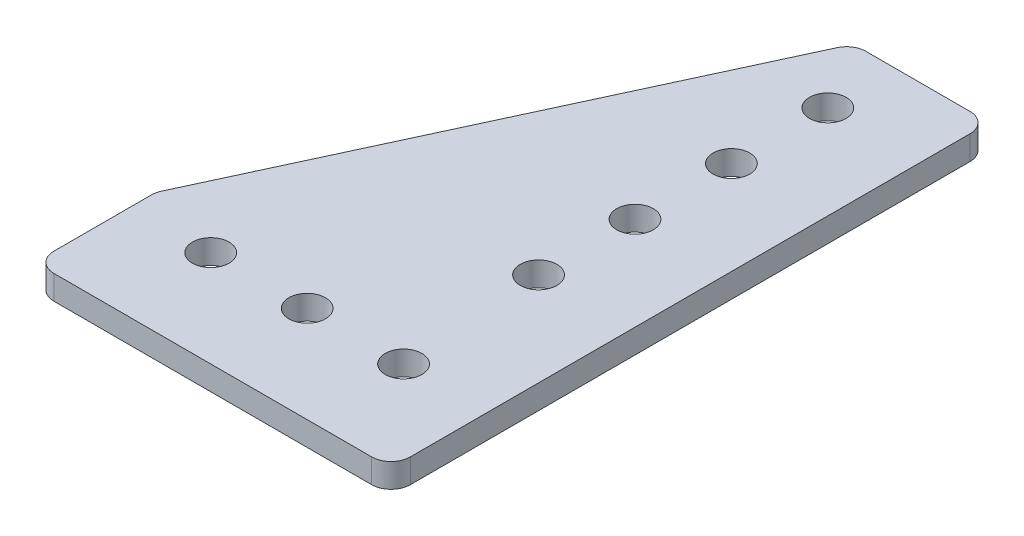
ISO-10303-21;
HEADER;
FILE_DESCRIPTION(('STEP AP214'),'2;1');
FILE_NAME('part.step','',(''),(''),'','','');
FILE_SCHEMA(('AUTOMOTIVE_DESIGN { 1 0 10303 214 1 1 1 1 }'));
ENDSEC;
DATA;
#1=APPLICATION_CONTEXT('core data for automotive mechanical design processes');
#2=APPLICATION_PROTOCOL_DEFINITION('international standard','automotive_design',2000,#1);
#3=PRODUCT_CONTEXT('',#1,'mechanical');
#4=PRODUCT('Part','Part','',(#3));
#5=PRODUCT_RELATED_PRODUCT_CATEGORY('part','',(#4));
#6=PRODUCT_DEFINITION_FORMATION('','',#4);
#7=PRODUCT_DEFINITION_CONTEXT('part definition',#1,'design');
#8=PRODUCT_DEFINITION('design','',#6,#7);
#9=PRODUCT_DEFINITION_SHAPE('','',#8);
#10=(LENGTH_UNIT() NAMED_UNIT(*) SI_UNIT(.MILLI.,.METRE.));
#11=(NAMED_UNIT(*) PLANE_ANGLE_UNIT() SI_UNIT($,.RADIAN.));
#12=(NAMED_UNIT(*) SI_UNIT($,.STERADIAN.) SOLID_ANGLE_UNIT());
#13=UNCERTAINTY_MEASURE_WITH_UNIT(LENGTH_MEASURE(1.E-05),#10,'distance_accuracy_value','');
#14=(GEOMETRIC_REPRESENTATION_CONTEXT(3) GLOBAL_UNCERTAINTY_ASSIGNED_CONTEXT((#13)) GLOBAL_UNIT_ASSIGNED_CONTEXT((#10,
#11,#12)) REPRESENTATION_CONTEXT('',''));
#15=CARTESIAN_POINT('',(0.,0.,0.));
#16=DIRECTION('',(0.,0.,1.));
#17=DIRECTION('',(1.,0.,0.));
#18=AXIS2_PLACEMENT_3D('',#15,#16,#17);
#19=CARTESIAN_POINT('',(0.,3.175,0.));
#20=DIRECTION('',(0.,0.,-1.));
#21=DIRECTION('',(-1.,0.,0.));
#22=AXIS2_PLACEMENT_3D('',#19,#20,#21);
#23=PLANE('',#22);
#24=DIRECTION('',(1.,0.,0.));
#25=VECTOR('',#24,1.);
#26=CARTESIAN_POINT('',(0.,3.175,0.));
#27=LINE('',#26,#25);
#28=CARTESIAN_POINT('',(6.39976522610476,3.175,0.));
#29=VERTEX_POINT('',#28);
#30=CARTESIAN_POINT('',(48.26,3.175,0.));
#31=VERTEX_POINT('',#30);
#32=EDGE_CURVE('E215',#29,#31,#27,.T.);
#33=ORIENTED_EDGE('',*,*,#32,.F.);
#34=DIRECTION('',(0.,1.,0.));
#35=VECTOR('',#34,1.);
#36=CARTESIAN_POINT('',(6.39976522610476,3.175,0.));
#37=LINE('',#36,#35);
#38=CARTESIAN_POINT('',(6.39976522610476,0.,0.));
#39=VERTEX_POINT('',#38);
#40=EDGE_CURVE('E62',#29,#39,#37,.F.);
#41=ORIENTED_EDGE('',*,*,#40,.T.);
#42=DIRECTION('',(1.,0.,0.));
#43=VECTOR('',#42,1.);
#44=CARTESIAN_POINT('',(0.,0.,0.));
#45=LINE('',#44,#43);
#46=CARTESIAN_POINT('',(48.26,0.,0.));
#47=VERTEX_POINT('',#46);
#48=EDGE_CURVE('E211',#39,#47,#45,.T.);
#49=ORIENTED_EDGE('',*,*,#48,.T.);
#50=DIRECTION('',(0.,-1.,0.));
#51=VECTOR('',#50,1.);
#52=CARTESIAN_POINT('',(48.26,3.175,0.));
#53=LINE('',#52,#51);
#54=EDGE_CURVE('E260',#47,#31,#53,.F.);
#55=ORIENTED_EDGE('',*,*,#54,.T.);
#56=EDGE_LOOP('',(#33,#41,#49,#55));
#57=FACE_BOUND('',#56,.T.);
#58=ADVANCED_FACE('F39',(#57),#23,.F.);
#59=CARTESIAN_POINT('',(50.8,3.175,0.));
#60=DIRECTION('',(-1.,0.,0.));
#61=DIRECTION('',(0.,0.,1.));
#62=AXIS2_PLACEMENT_3D('',#59,#60,#61);
#63=PLANE('',#62);
#64=DIRECTION('',(0.,0.,-1.));
#65=VECTOR('',#64,1.);
#66=CARTESIAN_POINT('',(50.8,3.175,0.));
#67=LINE('',#66,#65);
#68=CARTESIAN_POINT('',(50.8,3.175,-2.54));
#69=VERTEX_POINT('',#68);
#70=CARTESIAN_POINT('',(50.8,3.175,-76.2685913478438));
#71=VERTEX_POINT('',#70);
#72=EDGE_CURVE('E219',#69,#71,#67,.T.);
#73=ORIENTED_EDGE('',*,*,#72,.F.);
#74=DIRECTION('',(0.,-1.,0.));
#75=VECTOR('',#74,1.);
#76=CARTESIAN_POINT('',(50.8,3.175,-2.54));
#77=LINE('',#76,#75);
#78=CARTESIAN_POINT('',(50.8,0.,-2.54));
#79=VERTEX_POINT('',#78);
#80=EDGE_CURVE('E269',#69,#79,#77,.T.);
#81=ORIENTED_EDGE('',*,*,#80,.T.);
#82=DIRECTION('',(0.,0.,-1.));
#83=VECTOR('',#82,1.);
#84=CARTESIAN_POINT('',(50.8,0.,0.));
#85=LINE('',#84,#83);
#86=CARTESIAN_POINT('',(50.8,0.,-76.2685913478438));
#87=VERTEX_POINT('',#86);
#88=EDGE_CURVE('E220',#79,#87,#85,.T.);
#89=ORIENTED_EDGE('',*,*,#88,.T.);
#90=DIRECTION('',(0.,1.,0.));
#91=VECTOR('',#90,1.);
#92=CARTESIAN_POINT('',(50.8,3.175,-76.2685913478438));
#93=LINE('',#92,#91);
#94=EDGE_CURVE('E265',#87,#71,#93,.T.);
#95=ORIENTED_EDGE('',*,*,#94,.T.);
#96=EDGE_LOOP('',(#73,#81,#89,#95));
#97=FACE_BOUND('',#96,.T.);
#98=ADVANCED_FACE('F288',(#97),#63,.F.);
#99=CARTESIAN_POINT('',(0.,3.175,0.));
#100=DIRECTION('',(0.,-1.,0.));
#101=DIRECTION('',(0.,0.,-1.));
#102=AXIS2_PLACEMENT_3D('',#99,#100,#101);
#103=PLANE('',#102);
#104=CARTESIAN_POINT('',(38.4826821741964,3.175,-69.8500000000012));
#105=DIRECTION('',(0.,1.,0.));
#106=DIRECTION('',(0.,0.,1.));
#107=AXIS2_PLACEMENT_3D('',#104,#105,#106);
#108=CIRCLE('',#107,2.41299999999999);
#109=CARTESIAN_POINT('',(38.4826821741964,3.175,-67.4370000000012));
#110=VERTEX_POINT('',#109);
#111=EDGE_CURVE('E202',#110,#110,#108,.T.);
#112=ORIENTED_EDGE('',*,*,#111,.F.);
#113=EDGE_LOOP('',(#112));
#114=FACE_BOUND('',#113,.T.);
#115=CARTESIAN_POINT('',(38.4826821741964,3.175,-57.1500000000012));
#116=DIRECTION('',(0.,1.,0.));
#117=DIRECTION('',(0.,0.,1.));
#118=AXIS2_PLACEMENT_3D('',#115,#116,#117);
#119=CIRCLE('',#118,2.41299999999999);
#120=CARTESIAN_POINT('',(38.4826821741964,3.175,-54.7370000000012));
#121=VERTEX_POINT('',#120);
#122=EDGE_CURVE('E194',#121,#121,#119,.T.);
#123=ORIENTED_EDGE('',*,*,#122,.F.);
#124=EDGE_LOOP('',(#123));
#125=FACE_BOUND('',#124,.T.);
#126=CARTESIAN_POINT('',(38.4826821741964,3.175,-44.4500000000012));
#127=DIRECTION('',(0.,1.,0.));
#128=DIRECTION('',(0.,0.,1.));
#129=AXIS2_PLACEMENT_3D('',#126,#127,#128);
#130=CIRCLE('',#129,2.41299999999999);
#131=CARTESIAN_POINT('',(38.4826821741964,3.175,-42.0370000000012));
#132=VERTEX_POINT('',#131);
#133=EDGE_CURVE('E186',#132,#132,#130,.T.);
#134=ORIENTED_EDGE('',*,*,#133,.F.);
#135=EDGE_LOOP('',(#134));
#136=FACE_BOUND('',#135,.T.);
#137=CARTESIAN_POINT('',(38.4826821741964,3.175,-31.7500000000012));
#138=DIRECTION('',(0.,1.,0.));
#139=DIRECTION('',(0.,0.,1.));
#140=AXIS2_PLACEMENT_3D('',#137,#138,#139);
#141=CIRCLE('',#140,2.41299999999999);
#142=CARTESIAN_POINT('',(38.4826821741964,3.175,-29.3370000000012));
#143=VERTEX_POINT('',#142);
#144=EDGE_CURVE('E178',#143,#143,#141,.T.);
#145=ORIENTED_EDGE('',*,*,#144,.F.);
#146=EDGE_LOOP('',(#145));
#147=FACE_BOUND('',#146,.T.);
#148=CARTESIAN_POINT('',(14.3526821741958,3.175,-12.7000000000005));
#149=DIRECTION('',(0.,1.,0.));
#150=DIRECTION('',(0.,0.,1.));
#151=AXIS2_PLACEMENT_3D('',#148,#149,#150);
#152=CIRCLE('',#151,2.41299999999999);
#153=CARTESIAN_POINT('',(14.3526821741958,3.175,-10.2870000000005));
#154=VERTEX_POINT('',#153);
#155=EDGE_CURVE('E170',#154,#154,#152,.T.);
#156=ORIENTED_EDGE('',*,*,#155,.F.);
#157=EDGE_LOOP('',(#156));
#158=FACE_BOUND('',#157,.T.);
#159=CARTESIAN_POINT('',(27.0526821741958,3.175,-12.7000000000005));
#160=DIRECTION('',(0.,1.,0.));
#161=DIRECTION('',(0.,0.,1.));
#162=AXIS2_PLACEMENT_3D('',#159,#160,#161);
#163=CIRCLE('',#162,2.41299999999999);
#164=CARTESIAN_POINT('',(27.0526821741958,3.175,-10.2870000000005));
#165=VERTEX_POINT('',#164);
#166=EDGE_CURVE('E162',#165,#165,#163,.T.);
#167=ORIENTED_EDGE('',*,*,#166,.F.);
#168=EDGE_LOOP('',(#167));
#169=FACE_BOUND('',#168,.T.);
#170=CARTESIAN_POINT('',(39.7526821741958,3.175,-12.7000000000005));
#171=DIRECTION('',(0.,1.,0.));
#172=DIRECTION('',(0.,0.,1.));
#173=AXIS2_PLACEMENT_3D('',#170,#171,#172);
#174=CIRCLE('',#173,2.41299999999999);
#175=CARTESIAN_POINT('',(39.7526821741958,3.175,-10.2870000000005));
#176=VERTEX_POINT('',#175);
#177=EDGE_CURVE('E161',#176,#176,#174,.T.);
#178=ORIENTED_EDGE('',*,*,#177,.F.);
#179=EDGE_LOOP('',(#178));
#180=FACE_BOUND('',#179,.T.);
#181=DIRECTION('',(0.419462745816223,0.,-0.907772551288215));
#182=VECTOR('',#181,1.);
#183=CARTESIAN_POINT('',(3.85976522610476,3.175,-15.9467930525865));
#184=LINE('',#183,#182);
#185=CARTESIAN_POINT('',(4.0940229458327,3.175,-16.4537575685475));
#186=VERTEX_POINT('',#185);
#187=CARTESIAN_POINT('',(32.2255244205022,3.175,-77.334026722217));
#188=VERTEX_POINT('',#187);
#189=EDGE_CURVE('E135',#186,#188,#184,.T.);
#190=ORIENTED_EDGE('',*,*,#189,.F.);
#191=CARTESIAN_POINT('',(6.39976522610476,3.175,-15.3883221941743));
#192=DIRECTION('',(0.,-1.,0.));
#193=DIRECTION('',(0.,0.,-1.));
#194=AXIS2_PLACEMENT_3D('',#191,#192,#193);
#195=CIRCLE('',#194,2.54);
#196=CARTESIAN_POINT('',(3.85976522610476,3.175,-15.3883221941743));
#197=VERTEX_POINT('',#196);
#198=EDGE_CURVE('E117',#186,#197,#195,.F.);
#199=ORIENTED_EDGE('',*,*,#198,.T.);
#200=DIRECTION('',(0.,0.,-1.));
#201=VECTOR('',#200,1.);
#202=CARTESIAN_POINT('',(3.85976522610476,3.175,0.));
#203=LINE('',#202,#201);
#204=CARTESIAN_POINT('',(3.85976522610476,3.175,-2.54));
#205=VERTEX_POINT('',#204);
#206=EDGE_CURVE('E147',#205,#197,#203,.T.);
#207=ORIENTED_EDGE('',*,*,#206,.F.);
#208=CARTESIAN_POINT('',(6.39976522610476,3.175,-2.54));
#209=DIRECTION('',(0.,-1.,0.));
#210=DIRECTION('',(0.,0.,-1.));
#211=AXIS2_PLACEMENT_3D('',#208,#209,#210);
#212=CIRCLE('',#211,2.54);
#213=EDGE_CURVE('E129',#205,#29,#212,.F.);
#214=ORIENTED_EDGE('',*,*,#213,.T.);
#215=ORIENTED_EDGE('',*,*,#32,.T.);
#216=CARTESIAN_POINT('',(48.26,3.175,-2.54));
#217=DIRECTION('',(0.,-1.,0.));
#218=DIRECTION('',(0.,0.,-1.));
#219=AXIS2_PLACEMENT_3D('',#216,#217,#218);
#220=CIRCLE('',#219,2.54);
#221=EDGE_CURVE('E236',#31,#69,#220,.F.);
#222=ORIENTED_EDGE('',*,*,#221,.T.);
#223=ORIENTED_EDGE('',*,*,#72,.T.);
#224=CARTESIAN_POINT('',(48.26,3.175,-76.2685913478438));
#225=DIRECTION('',(0.,-1.,0.));
#226=DIRECTION('',(0.,0.,-1.));
#227=AXIS2_PLACEMENT_3D('',#224,#225,#226);
#228=CIRCLE('',#227,2.54);
#229=CARTESIAN_POINT('',(48.26,3.175,-78.8085913478438));
#230=VERTEX_POINT('',#229);
#231=EDGE_CURVE('E233',#71,#230,#228,.F.);
#232=ORIENTED_EDGE('',*,*,#231,.T.);
#233=DIRECTION('',(1.,0.,0.));
#234=VECTOR('',#233,1.);
#235=CARTESIAN_POINT('',(32.9068899518471,3.175,-78.8085913478438));
#236=LINE('',#235,#234);
#237=CARTESIAN_POINT('',(34.5312667007742,3.175,-78.8085913478438));
#238=VERTEX_POINT('',#237);
#239=EDGE_CURVE('E146',#238,#230,#236,.T.);
#240=ORIENTED_EDGE('',*,*,#239,.F.);
#241=CARTESIAN_POINT('',(34.5312667007742,3.175,-76.2685913478438));
#242=DIRECTION('',(0.,-1.,0.));
#243=DIRECTION('',(0.,0.,-1.));
#244=AXIS2_PLACEMENT_3D('',#241,#242,#243);
#245=CIRCLE('',#244,2.54);
#246=EDGE_CURVE('E140',#238,#188,#245,.F.);
#247=ORIENTED_EDGE('',*,*,#246,.T.);
#248=EDGE_LOOP('',(#190,#199,#207,#214,#215,#222,#223,#232,#240,#247));
#249=FACE_BOUND('',#248,.T.);
#250=ADVANCED_FACE('F143',(#114,#125,#136,#147,#158,#169,#180,#249),#103,.F.);
#251=CARTESIAN_POINT('',(0.,0.,0.));
#252=DIRECTION('',(0.,-1.,0.));
#253=DIRECTION('',(0.,0.,-1.));
#254=AXIS2_PLACEMENT_3D('',#251,#252,#253);
#255=PLANE('',#254);
#256=DIRECTION('',(0.,0.,-1.));
#257=VECTOR('',#256,1.);
#258=CARTESIAN_POINT('',(3.85976522610476,0.,0.));
#259=LINE('',#258,#257);
#260=CARTESIAN_POINT('',(3.85976522610476,0.,-2.54));
#261=VERTEX_POINT('',#260);
#262=CARTESIAN_POINT('',(3.85976522610476,0.,-15.3883221941743));
#263=VERTEX_POINT('',#262);
#264=EDGE_CURVE('E152',#261,#263,#259,.T.);
#265=ORIENTED_EDGE('',*,*,#264,.T.);
#266=CARTESIAN_POINT('',(6.39976522610476,0.,-15.3883221941743));
#267=DIRECTION('',(0.,-1.,0.));
#268=DIRECTION('',(0.,0.,-1.));
#269=AXIS2_PLACEMENT_3D('',#266,#267,#268);
#270=CIRCLE('',#269,2.54);
#271=CARTESIAN_POINT('',(4.0940229458327,0.,-16.4537575685475));
#272=VERTEX_POINT('',#271);
#273=EDGE_CURVE('E257',#263,#272,#270,.T.);
#274=ORIENTED_EDGE('',*,*,#273,.T.);
#275=DIRECTION('',(0.419462745816223,0.,-0.907772551288215));
#276=VECTOR('',#275,1.);
#277=CARTESIAN_POINT('',(3.85976522610476,0.,-15.9467930525865));
#278=LINE('',#277,#276);
#279=CARTESIAN_POINT('',(32.2255244205022,0.,-77.334026722217));
#280=VERTEX_POINT('',#279);
#281=EDGE_CURVE('E138',#272,#280,#278,.T.);
#282=ORIENTED_EDGE('',*,*,#281,.T.);
#283=CARTESIAN_POINT('',(34.5312667007742,0.,-76.2685913478438));
#284=DIRECTION('',(0.,-1.,0.));
#285=DIRECTION('',(0.,0.,-1.));
#286=AXIS2_PLACEMENT_3D('',#283,#284,#285);
#287=CIRCLE('',#286,2.54);
#288=CARTESIAN_POINT('',(34.5312667007742,0.,-78.8085913478438));
#289=VERTEX_POINT('',#288);
#290=EDGE_CURVE('E246',#280,#289,#287,.T.);
#291=ORIENTED_EDGE('',*,*,#290,.T.);
#292=DIRECTION('',(1.,0.,0.));
#293=VECTOR('',#292,1.);
#294=CARTESIAN_POINT('',(32.9068899518471,0.,-78.8085913478438));
#295=LINE('',#294,#293);
#296=CARTESIAN_POINT('',(48.26,0.,-78.8085913478438));
#297=VERTEX_POINT('',#296);
#298=EDGE_CURVE('E206',#289,#297,#295,.T.);
#299=ORIENTED_EDGE('',*,*,#298,.T.);
#300=CARTESIAN_POINT('',(48.26,0.,-76.2685913478438));
#301=DIRECTION('',(0.,-1.,0.));
#302=DIRECTION('',(0.,0.,-1.));
#303=AXIS2_PLACEMENT_3D('',#300,#301,#302);
#304=CIRCLE('',#303,2.54);
#305=EDGE_CURVE('E249',#297,#87,#304,.T.);
#306=ORIENTED_EDGE('',*,*,#305,.T.);
#307=ORIENTED_EDGE('',*,*,#88,.F.);
#308=CARTESIAN_POINT('',(48.26,0.,-2.54));
#309=DIRECTION('',(0.,-1.,0.));
#310=DIRECTION('',(0.,0.,-1.));
#311=AXIS2_PLACEMENT_3D('',#308,#309,#310);
#312=CIRCLE('',#311,2.54);
#313=EDGE_CURVE('E55',#79,#47,#312,.T.);
#314=ORIENTED_EDGE('',*,*,#313,.T.);
#315=ORIENTED_EDGE('',*,*,#48,.F.);
#316=CARTESIAN_POINT('',(6.39976522610476,0.,-2.54));
#317=DIRECTION('',(0.,-1.,0.));
#318=DIRECTION('',(0.,0.,-1.));
#319=AXIS2_PLACEMENT_3D('',#316,#317,#318);
#320=CIRCLE('',#319,2.54);
#321=EDGE_CURVE('E254',#39,#261,#320,.T.);
#322=ORIENTED_EDGE('',*,*,#321,.T.);
#323=EDGE_LOOP('',(#265,#274,#282,#291,#299,#306,#307,#314,#315,#322));
#324=FACE_BOUND('',#323,.T.);
#325=CARTESIAN_POINT('',(38.4826821741964,0.,-69.8500000000012));
#326=DIRECTION('',(0.,1.,0.));
#327=DIRECTION('',(0.,0.,1.));
#328=AXIS2_PLACEMENT_3D('',#325,#326,#327);
#329=CIRCLE('',#328,2.41299999999999);
#330=CARTESIAN_POINT('',(38.4826821741964,0.,-67.4370000000012));
#331=VERTEX_POINT('',#330);
#332=EDGE_CURVE('E198',#331,#331,#329,.T.);
#333=ORIENTED_EDGE('',*,*,#332,.T.);
#334=EDGE_LOOP('',(#333));
#335=FACE_BOUND('',#334,.T.);
#336=CARTESIAN_POINT('',(38.4826821741964,0.,-57.1500000000012));
#337=DIRECTION('',(0.,1.,0.));
#338=DIRECTION('',(0.,0.,1.));
#339=AXIS2_PLACEMENT_3D('',#336,#337,#338);
#340=CIRCLE('',#339,2.41299999999999);
#341=CARTESIAN_POINT('',(38.4826821741964,0.,-54.7370000000012));
#342=VERTEX_POINT('',#341);
#343=EDGE_CURVE('E190',#342,#342,#340,.T.);
#344=ORIENTED_EDGE('',*,*,#343,.T.);
#345=EDGE_LOOP('',(#344));
#346=FACE_BOUND('',#345,.T.);
#347=CARTESIAN_POINT('',(38.4826821741964,0.,-44.4500000000012));
#348=DIRECTION('',(0.,1.,0.));
#349=DIRECTION('',(0.,0.,1.));
#350=AXIS2_PLACEMENT_3D('',#347,#348,#349);
#351=CIRCLE('',#350,2.41299999999999);
#352=CARTESIAN_POINT('',(38.4826821741964,0.,-42.0370000000012));
#353=VERTEX_POINT('',#352);
#354=EDGE_CURVE('E182',#353,#353,#351,.T.);
#355=ORIENTED_EDGE('',*,*,#354,.T.);
#356=EDGE_LOOP('',(#355));
#357=FACE_BOUND('',#356,.T.);
#358=CARTESIAN_POINT('',(38.4826821741964,0.,-31.7500000000012));
#359=DIRECTION('',(0.,1.,0.));
#360=DIRECTION('',(0.,0.,1.));
#361=AXIS2_PLACEMENT_3D('',#358,#359,#360);
#362=CIRCLE('',#361,2.41299999999999);
#363=CARTESIAN_POINT('',(38.4826821741964,0.,-29.3370000000012));
#364=VERTEX_POINT('',#363);
#365=EDGE_CURVE('E174',#364,#364,#362,.T.);
#366=ORIENTED_EDGE('',*,*,#365,.T.);
#367=EDGE_LOOP('',(#366));
#368=FACE_BOUND('',#367,.T.);
#369=CARTESIAN_POINT('',(14.3526821741958,0.,-12.7000000000005));
#370=DIRECTION('',(0.,1.,0.));
#371=DIRECTION('',(0.,0.,1.));
#372=AXIS2_PLACEMENT_3D('',#369,#370,#371);
#373=CIRCLE('',#372,2.41299999999999);
#374=CARTESIAN_POINT('',(14.3526821741958,0.,-10.2870000000005));
#375=VERTEX_POINT('',#374);
#376=EDGE_CURVE('E166',#375,#375,#373,.T.);
#377=ORIENTED_EDGE('',*,*,#376,.T.);
#378=EDGE_LOOP('',(#377));
#379=FACE_BOUND('',#378,.T.);
#380=CARTESIAN_POINT('',(27.0526821741958,0.,-12.7000000000005));
#381=DIRECTION('',(0.,1.,0.));
#382=DIRECTION('',(0.,0.,1.));
#383=AXIS2_PLACEMENT_3D('',#380,#381,#382);
#384=CIRCLE('',#383,2.41299999999999);
#385=CARTESIAN_POINT('',(27.0526821741958,0.,-10.2870000000005));
#386=VERTEX_POINT('',#385);
#387=EDGE_CURVE('E157',#386,#386,#384,.T.);
#388=ORIENTED_EDGE('',*,*,#387,.T.);
#389=EDGE_LOOP('',(#388));
#390=FACE_BOUND('',#389,.T.);
#391=CARTESIAN_POINT('',(39.7526821741958,0.,-12.7000000000005));
#392=DIRECTION('',(0.,1.,0.));
#393=DIRECTION('',(0.,0.,1.));
#394=AXIS2_PLACEMENT_3D('',#391,#392,#393);
#395=CIRCLE('',#394,2.41299999999999);
#396=CARTESIAN_POINT('',(39.7526821741958,0.,-10.2870000000005));
#397=VERTEX_POINT('',#396);
#398=EDGE_CURVE('E207',#397,#397,#395,.T.);
#399=ORIENTED_EDGE('',*,*,#398,.T.);
#400=EDGE_LOOP('',(#399));
#401=FACE_BOUND('',#400,.T.);
#402=ADVANCED_FACE('F291',(#324,#335,#346,#357,#368,#379,#390,#401),#255,.T.);
#403=CARTESIAN_POINT('',(39.7526821741958,0.,-12.7000000000005));
#404=DIRECTION('',(0.,1.,0.));
#405=DIRECTION('',(0.,0.,1.));
#406=AXIS2_PLACEMENT_3D('',#403,#404,#405);
#407=CYLINDRICAL_SURFACE('',#406,2.41299999999999);
#408=ORIENTED_EDGE('',*,*,#398,.F.);
#409=EDGE_LOOP('',(#408));
#410=FACE_BOUND('',#409,.T.);
#411=ORIENTED_EDGE('',*,*,#177,.T.);
#412=EDGE_LOOP('',(#411));
#413=FACE_BOUND('',#412,.T.);
#414=ADVANCED_FACE('F339',(#410,#413),#407,.F.);
#415=CARTESIAN_POINT('',(27.0526821741958,0.,-12.7000000000005));
#416=DIRECTION('',(0.,1.,0.));
#417=DIRECTION('',(0.,0.,1.));
#418=AXIS2_PLACEMENT_3D('',#415,#416,#417);
#419=CYLINDRICAL_SURFACE('',#418,2.41299999999999);
#420=ORIENTED_EDGE('',*,*,#387,.F.);
#421=EDGE_LOOP('',(#420));
#422=FACE_BOUND('',#421,.T.);
#423=ORIENTED_EDGE('',*,*,#166,.T.);
#424=EDGE_LOOP('',(#423));
#425=FACE_BOUND('',#424,.T.);
#426=ADVANCED_FACE('F335',(#422,#425),#419,.F.);
#427=CARTESIAN_POINT('',(14.3526821741958,0.,-12.7000000000005));
#428=DIRECTION('',(0.,1.,0.));
#429=DIRECTION('',(0.,0.,1.));
#430=AXIS2_PLACEMENT_3D('',#427,#428,#429);
#431=CYLINDRICAL_SURFACE('',#430,2.41299999999999);
#432=ORIENTED_EDGE('',*,*,#376,.F.);
#433=EDGE_LOOP('',(#432));
#434=FACE_BOUND('',#433,.T.);
#435=ORIENTED_EDGE('',*,*,#155,.T.);
#436=EDGE_LOOP('',(#435));
#437=FACE_BOUND('',#436,.T.);
#438=ADVANCED_FACE('F338',(#434,#437),#431,.F.);
#439=CARTESIAN_POINT('',(38.4826821741964,0.,-31.7500000000012));
#440=DIRECTION('',(0.,1.,0.));
#441=DIRECTION('',(0.,0.,1.));
#442=AXIS2_PLACEMENT_3D('',#439,#440,#441);
#443=CYLINDRICAL_SURFACE('',#442,2.41299999999999);
#444=ORIENTED_EDGE('',*,*,#365,.F.);
#445=EDGE_LOOP('',(#444));
#446=FACE_BOUND('',#445,.T.);
#447=ORIENTED_EDGE('',*,*,#144,.T.);
#448=EDGE_LOOP('',(#447));
#449=FACE_BOUND('',#448,.T.);
#450=ADVANCED_FACE('F343',(#446,#449),#443,.F.);
#451=CARTESIAN_POINT('',(38.4826821741964,0.,-44.4500000000012));
#452=DIRECTION('',(0.,1.,0.));
#453=DIRECTION('',(0.,0.,1.));
#454=AXIS2_PLACEMENT_3D('',#451,#452,#453);
#455=CYLINDRICAL_SURFACE('',#454,2.41299999999999);
#456=ORIENTED_EDGE('',*,*,#354,.F.);
#457=EDGE_LOOP('',(#456));
#458=FACE_BOUND('',#457,.T.);
#459=ORIENTED_EDGE('',*,*,#133,.T.);
#460=EDGE_LOOP('',(#459));
#461=FACE_BOUND('',#460,.T.);
#462=ADVANCED_FACE('F347',(#458,#461),#455,.F.);
#463=CARTESIAN_POINT('',(38.4826821741964,0.,-57.1500000000012));
#464=DIRECTION('',(0.,1.,0.));
#465=DIRECTION('',(0.,0.,1.));
#466=AXIS2_PLACEMENT_3D('',#463,#464,#465);
#467=CYLINDRICAL_SURFACE('',#466,2.41299999999999);
#468=ORIENTED_EDGE('',*,*,#343,.F.);
#469=EDGE_LOOP('',(#468));
#470=FACE_BOUND('',#469,.T.);
#471=ORIENTED_EDGE('',*,*,#122,.T.);
#472=EDGE_LOOP('',(#471));
#473=FACE_BOUND('',#472,.T.);
#474=ADVANCED_FACE('F351',(#470,#473),#467,.F.);
#475=CARTESIAN_POINT('',(38.4826821741964,0.,-69.8500000000012));
#476=DIRECTION('',(0.,1.,0.));
#477=DIRECTION('',(0.,0.,1.));
#478=AXIS2_PLACEMENT_3D('',#475,#476,#477);
#479=CYLINDRICAL_SURFACE('',#478,2.41299999999999);
#480=ORIENTED_EDGE('',*,*,#332,.F.);
#481=EDGE_LOOP('',(#480));
#482=FACE_BOUND('',#481,.T.);
#483=ORIENTED_EDGE('',*,*,#111,.T.);
#484=EDGE_LOOP('',(#483));
#485=FACE_BOUND('',#484,.T.);
#486=ADVANCED_FACE('F355',(#482,#485),#479,.F.);
#487=CARTESIAN_POINT('',(32.9068899518471,0.,-78.8085913478438));
#488=DIRECTION('',(0.,0.,1.));
#489=DIRECTION('',(1.,0.,0.));
#490=AXIS2_PLACEMENT_3D('',#487,#488,#489);
#491=PLANE('',#490);
#492=ORIENTED_EDGE('',*,*,#239,.T.);
#493=DIRECTION('',(0.,1.,0.));
#494=VECTOR('',#493,1.);
#495=CARTESIAN_POINT('',(48.26,0.,-78.8085913478438));
#496=LINE('',#495,#494);
#497=EDGE_CURVE('E11',#230,#297,#496,.F.);
#498=ORIENTED_EDGE('',*,*,#497,.T.);
#499=ORIENTED_EDGE('',*,*,#298,.F.);
#500=DIRECTION('',(0.,1.,0.));
#501=VECTOR('',#500,1.);
#502=CARTESIAN_POINT('',(34.5312667007742,0.,-78.8085913478438));
#503=LINE('',#502,#501);
#504=EDGE_CURVE('E48',#289,#238,#503,.T.);
#505=ORIENTED_EDGE('',*,*,#504,.T.);
#506=EDGE_LOOP('',(#492,#498,#499,#505));
#507=FACE_BOUND('',#506,.T.);
#508=ADVANCED_FACE('F277',(#507),#491,.F.);
#509=CARTESIAN_POINT('',(3.85976522610476,0.,-15.9467930525865));
#510=DIRECTION('',(0.907772551288215,0.,0.419462745816223));
#511=DIRECTION('',(0.419462745816223,0.,-0.907772551288215));
#512=AXIS2_PLACEMENT_3D('',#509,#510,#511);
#513=PLANE('',#512);
#514=ORIENTED_EDGE('',*,*,#281,.F.);
#515=DIRECTION('',(0.,1.,0.));
#516=VECTOR('',#515,1.);
#517=CARTESIAN_POINT('',(4.0940229458327,0.,-16.4537575685475));
#518=LINE('',#517,#516);
#519=EDGE_CURVE('E121',#272,#186,#518,.T.);
#520=ORIENTED_EDGE('',*,*,#519,.T.);
#521=ORIENTED_EDGE('',*,*,#189,.T.);
#522=DIRECTION('',(0.,1.,0.));
#523=VECTOR('',#522,1.);
#524=CARTESIAN_POINT('',(32.2255244205022,0.,-77.334026722217));
#525=LINE('',#524,#523);
#526=EDGE_CURVE('E141',#188,#280,#525,.F.);
#527=ORIENTED_EDGE('',*,*,#526,.T.);
#528=EDGE_LOOP('',(#514,#520,#521,#527));
#529=FACE_BOUND('',#528,.T.);
#530=ADVANCED_FACE('F134',(#529),#513,.F.);
#531=CARTESIAN_POINT('',(3.85976522610476,0.,0.));
#532=DIRECTION('',(1.,0.,0.));
#533=DIRECTION('',(0.,0.,-1.));
#534=AXIS2_PLACEMENT_3D('',#531,#532,#533);
#535=PLANE('',#534);
#536=ORIENTED_EDGE('',*,*,#206,.T.);
#537=DIRECTION('',(0.,1.,0.));
#538=VECTOR('',#537,1.);
#539=CARTESIAN_POINT('',(3.85976522610476,0.,-15.3883221941743));
#540=LINE('',#539,#538);
#541=EDGE_CURVE('E122',#197,#263,#540,.F.);
#542=ORIENTED_EDGE('',*,*,#541,.T.);
#543=ORIENTED_EDGE('',*,*,#264,.F.);
#544=DIRECTION('',(0.,1.,0.));
#545=VECTOR('',#544,1.);
#546=CARTESIAN_POINT('',(3.85976522610476,0.,-2.54));
#547=LINE('',#546,#545);
#548=EDGE_CURVE('E128',#261,#205,#547,.T.);
#549=ORIENTED_EDGE('',*,*,#548,.T.);
#550=EDGE_LOOP('',(#536,#542,#543,#549));
#551=FACE_BOUND('',#550,.T.);
#552=ADVANCED_FACE('F302',(#551),#535,.F.);
#553=CARTESIAN_POINT('',(6.39976522610476,0.,-15.3883221941743));
#554=DIRECTION('',(0.,1.,0.));
#555=DIRECTION('',(0.,0.,1.));
#556=AXIS2_PLACEMENT_3D('',#553,#554,#555);
#557=CYLINDRICAL_SURFACE('',#556,2.54);
#558=ORIENTED_EDGE('',*,*,#273,.F.);
#559=ORIENTED_EDGE('',*,*,#541,.F.);
#560=ORIENTED_EDGE('',*,*,#198,.F.);
#561=ORIENTED_EDGE('',*,*,#519,.F.);
#562=EDGE_LOOP('',(#558,#559,#560,#561));
#563=FACE_BOUND('',#562,.T.);
#564=ADVANCED_FACE('F120',(#563),#557,.T.);
#565=CARTESIAN_POINT('',(6.39976522610476,0.,-2.54));
#566=DIRECTION('',(0.,1.,0.));
#567=DIRECTION('',(0.,0.,1.));
#568=AXIS2_PLACEMENT_3D('',#565,#566,#567);
#569=CYLINDRICAL_SURFACE('',#568,2.54);
#570=ORIENTED_EDGE('',*,*,#321,.F.);
#571=ORIENTED_EDGE('',*,*,#40,.F.);
#572=ORIENTED_EDGE('',*,*,#213,.F.);
#573=ORIENTED_EDGE('',*,*,#548,.F.);
#574=EDGE_LOOP('',(#570,#571,#572,#573));
#575=FACE_BOUND('',#574,.T.);
#576=ADVANCED_FACE('F304',(#575),#569,.T.);
#577=CARTESIAN_POINT('',(48.26,3.175,-2.54));
#578=DIRECTION('',(0.,-1.,0.));
#579=DIRECTION('',(0.,0.,-1.));
#580=AXIS2_PLACEMENT_3D('',#577,#578,#579);
#581=CYLINDRICAL_SURFACE('',#580,2.54);
#582=ORIENTED_EDGE('',*,*,#221,.F.);
#583=ORIENTED_EDGE('',*,*,#54,.F.);
#584=ORIENTED_EDGE('',*,*,#313,.F.);
#585=ORIENTED_EDGE('',*,*,#80,.F.);
#586=EDGE_LOOP('',(#582,#583,#584,#585));
#587=FACE_BOUND('',#586,.T.);
#588=ADVANCED_FACE('F308',(#587),#581,.T.);
#589=CARTESIAN_POINT('',(48.26,3.175,-76.2685913478438));
#590=DIRECTION('',(0.,1.,0.));
#591=DIRECTION('',(0.,0.,1.));
#592=AXIS2_PLACEMENT_3D('',#589,#590,#591);
#593=CYLINDRICAL_SURFACE('',#592,2.54);
#594=ORIENTED_EDGE('',*,*,#305,.F.);
#595=ORIENTED_EDGE('',*,*,#497,.F.);
#596=ORIENTED_EDGE('',*,*,#231,.F.);
#597=ORIENTED_EDGE('',*,*,#94,.F.);
#598=EDGE_LOOP('',(#594,#595,#596,#597));
#599=FACE_BOUND('',#598,.T.);
#600=ADVANCED_FACE('F286',(#599),#593,.T.);
#601=CARTESIAN_POINT('',(34.5312667007742,0.,-76.2685913478438));
#602=DIRECTION('',(0.,1.,0.));
#603=DIRECTION('',(0.,0.,1.));
#604=AXIS2_PLACEMENT_3D('',#601,#602,#603);
#605=CYLINDRICAL_SURFACE('',#604,2.54);
#606=ORIENTED_EDGE('',*,*,#290,.F.);
#607=ORIENTED_EDGE('',*,*,#526,.F.);
#608=ORIENTED_EDGE('',*,*,#246,.F.);
#609=ORIENTED_EDGE('',*,*,#504,.F.);
#610=EDGE_LOOP('',(#606,#607,#608,#609));
#611=FACE_BOUND('',#610,.T.);
#612=ADVANCED_FACE('F41',(#611),#605,.T.);
#613=CLOSED_SHELL('',(#58,#98,#250,#402,#414,#426,#438,#450,#462,#474,#486,#508,#530,#552,#564,
#576,#588,#600,#612));
#614=MANIFOLD_SOLID_BREP('B2',#613);
#615=ADVANCED_BREP_SHAPE_REPRESENTATION('',(#18,#614),#14);
#616=SHAPE_DEFINITION_REPRESENTATION(#9,#615);
ENDSEC;
END-ISO-10303-21;
